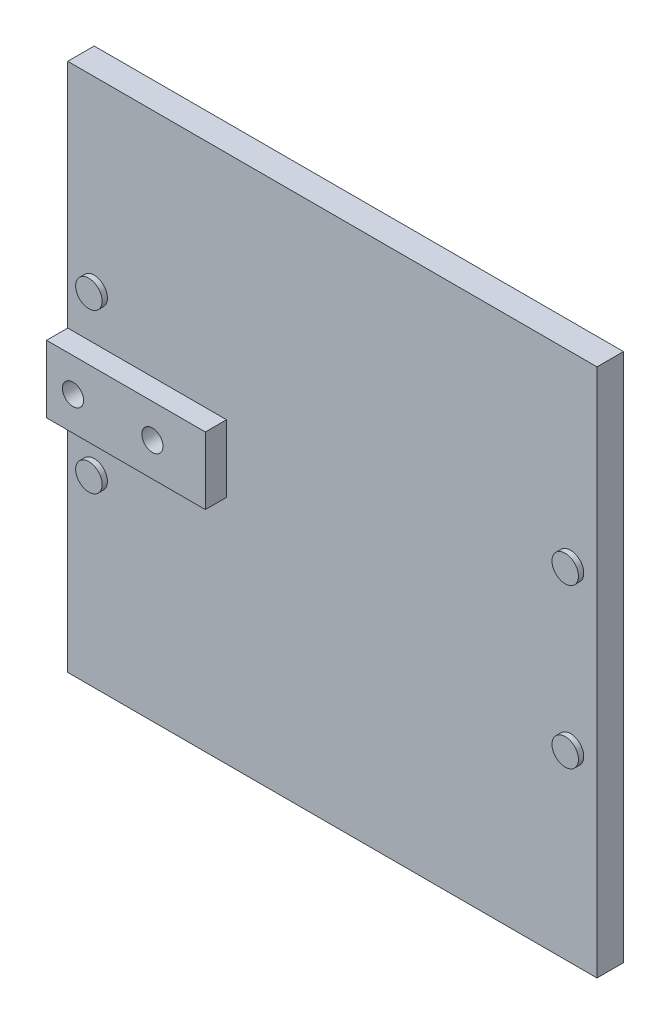
ISO-10303-21;
HEADER;
FILE_DESCRIPTION(('STEP AP214'),'2;1');
FILE_NAME('part.step','',(''),(''),'','','');
FILE_SCHEMA(('AUTOMOTIVE_DESIGN { 1 0 10303 214 1 1 1 1 }'));
ENDSEC;
DATA;
#1=APPLICATION_CONTEXT('core data for automotive mechanical design processes');
#2=APPLICATION_PROTOCOL_DEFINITION('international standard','automotive_design',2000,#1);
#3=PRODUCT_CONTEXT('',#1,'mechanical');
#4=PRODUCT('Part','Part','',(#3));
#5=PRODUCT_RELATED_PRODUCT_CATEGORY('part','',(#4));
#6=PRODUCT_DEFINITION_FORMATION('','',#4);
#7=PRODUCT_DEFINITION_CONTEXT('part definition',#1,'design');
#8=PRODUCT_DEFINITION('design','',#6,#7);
#9=PRODUCT_DEFINITION_SHAPE('','',#8);
#10=(LENGTH_UNIT() NAMED_UNIT(*) SI_UNIT(.MILLI.,.METRE.));
#11=(NAMED_UNIT(*) PLANE_ANGLE_UNIT() SI_UNIT($,.RADIAN.));
#12=(NAMED_UNIT(*) SI_UNIT($,.STERADIAN.) SOLID_ANGLE_UNIT());
#13=UNCERTAINTY_MEASURE_WITH_UNIT(LENGTH_MEASURE(1.E-05),#10,'distance_accuracy_value','');
#14=(GEOMETRIC_REPRESENTATION_CONTEXT(3) GLOBAL_UNCERTAINTY_ASSIGNED_CONTEXT((#13)) GLOBAL_UNIT_ASSIGNED_CONTEXT((#10,
#11,#12)) REPRESENTATION_CONTEXT('',''));
#15=CARTESIAN_POINT('',(0.,0.,0.));
#16=DIRECTION('',(0.,0.,1.));
#17=DIRECTION('',(1.,0.,0.));
#18=AXIS2_PLACEMENT_3D('',#15,#16,#17);
#19=CARTESIAN_POINT('',(45.,-15.,6.));
#20=DIRECTION('',(0.,0.,-1.));
#21=DIRECTION('',(-1.,0.,0.));
#22=AXIS2_PLACEMENT_3D('',#19,#20,#21);
#23=CYLINDRICAL_SURFACE('',#22,2.5);
#24=CARTESIAN_POINT('',(45.,-15.,6.));
#25=DIRECTION('',(0.,0.,1.));
#26=DIRECTION('',(1.,0.,0.));
#27=AXIS2_PLACEMENT_3D('',#24,#25,#26);
#28=CIRCLE('',#27,2.5);
#29=CARTESIAN_POINT('',(47.5,-15.,6.));
#30=VERTEX_POINT('',#29);
#31=EDGE_CURVE('E11',#30,#30,#28,.T.);
#32=ORIENTED_EDGE('',*,*,#31,.F.);
#33=EDGE_LOOP('',(#32));
#34=FACE_BOUND('',#33,.T.);
#35=CARTESIAN_POINT('',(45.,-15.,5.));
#36=DIRECTION('',(0.,0.,1.));
#37=DIRECTION('',(1.,0.,0.));
#38=AXIS2_PLACEMENT_3D('',#35,#36,#37);
#39=CIRCLE('',#38,2.5);
#40=CARTESIAN_POINT('',(47.5,-15.,5.));
#41=VERTEX_POINT('',#40);
#42=EDGE_CURVE('E45',#41,#41,#39,.T.);
#43=ORIENTED_EDGE('',*,*,#42,.T.);
#44=EDGE_LOOP('',(#43));
#45=FACE_BOUND('',#44,.T.);
#46=ADVANCED_FACE('F42',(#34,#45),#23,.T.);
#47=CARTESIAN_POINT('',(45.,-15.,6.));
#48=DIRECTION('',(0.,0.,1.));
#49=DIRECTION('',(1.,0.,0.));
#50=AXIS2_PLACEMENT_3D('',#47,#48,#49);
#51=PLANE('',#50);
#52=ORIENTED_EDGE('',*,*,#31,.T.);
#53=EDGE_LOOP('',(#52));
#54=FACE_BOUND('',#53,.T.);
#55=ADVANCED_FACE('F57',(#54),#51,.T.);
#56=CARTESIAN_POINT('',(45.,-15.,5.));
#57=DIRECTION('',(0.,0.,1.));
#58=DIRECTION('',(1.,0.,0.));
#59=AXIS2_PLACEMENT_3D('',#56,#57,#58);
#60=PLANE('',#59);
#61=ORIENTED_EDGE('',*,*,#42,.F.);
#62=EDGE_LOOP('',(#61));
#63=FACE_BOUND('',#62,.T.);
#64=ADVANCED_FACE('F55',(#63),#60,.F.);
#65=CLOSED_SHELL('',(#46,#55,#64));
#66=MANIFOLD_SOLID_BREP('B2',#65);
#67=CARTESIAN_POINT('',(-45.,-15.,6.));
#68=DIRECTION('',(0.,0.,-1.));
#69=DIRECTION('',(-1.,0.,0.));
#70=AXIS2_PLACEMENT_3D('',#67,#68,#69);
#71=CYLINDRICAL_SURFACE('',#70,2.5);
#72=CARTESIAN_POINT('',(-45.,-15.,6.));
#73=DIRECTION('',(0.,0.,1.));
#74=DIRECTION('',(1.,0.,0.));
#75=AXIS2_PLACEMENT_3D('',#72,#73,#74);
#76=CIRCLE('',#75,2.5);
#77=CARTESIAN_POINT('',(-42.5,-15.,6.));
#78=VERTEX_POINT('',#77);
#79=EDGE_CURVE('E41',#78,#78,#76,.T.);
#80=ORIENTED_EDGE('',*,*,#79,.F.);
#81=EDGE_LOOP('',(#80));
#82=FACE_BOUND('',#81,.T.);
#83=CARTESIAN_POINT('',(-45.,-15.,5.));
#84=DIRECTION('',(0.,0.,1.));
#85=DIRECTION('',(1.,0.,0.));
#86=AXIS2_PLACEMENT_3D('',#83,#84,#85);
#87=CIRCLE('',#86,2.5);
#88=CARTESIAN_POINT('',(-42.5,-15.,5.));
#89=VERTEX_POINT('',#88);
#90=EDGE_CURVE('E94',#89,#89,#87,.T.);
#91=ORIENTED_EDGE('',*,*,#90,.T.);
#92=EDGE_LOOP('',(#91));
#93=FACE_BOUND('',#92,.T.);
#94=ADVANCED_FACE('F91',(#82,#93),#71,.T.);
#95=CARTESIAN_POINT('',(-45.,-15.,6.));
#96=DIRECTION('',(0.,0.,1.));
#97=DIRECTION('',(1.,0.,0.));
#98=AXIS2_PLACEMENT_3D('',#95,#96,#97);
#99=PLANE('',#98);
#100=ORIENTED_EDGE('',*,*,#79,.T.);
#101=EDGE_LOOP('',(#100));
#102=FACE_BOUND('',#101,.T.);
#103=ADVANCED_FACE('F106',(#102),#99,.T.);
#104=CARTESIAN_POINT('',(-45.,-15.,5.));
#105=DIRECTION('',(0.,0.,1.));
#106=DIRECTION('',(1.,0.,0.));
#107=AXIS2_PLACEMENT_3D('',#104,#105,#106);
#108=PLANE('',#107);
#109=ORIENTED_EDGE('',*,*,#90,.F.);
#110=EDGE_LOOP('',(#109));
#111=FACE_BOUND('',#110,.T.);
#112=ADVANCED_FACE('F104',(#111),#108,.F.);
#113=CLOSED_SHELL('',(#94,#103,#112));
#114=MANIFOLD_SOLID_BREP('B6',#113);
#115=CARTESIAN_POINT('',(45.,15.,6.));
#116=DIRECTION('',(0.,0.,-1.));
#117=DIRECTION('',(-1.,0.,0.));
#118=AXIS2_PLACEMENT_3D('',#115,#116,#117);
#119=CYLINDRICAL_SURFACE('',#118,2.5);
#120=CARTESIAN_POINT('',(45.,15.,6.));
#121=DIRECTION('',(0.,0.,1.));
#122=DIRECTION('',(1.,0.,0.));
#123=AXIS2_PLACEMENT_3D('',#120,#121,#122);
#124=CIRCLE('',#123,2.5);
#125=CARTESIAN_POINT('',(47.5,15.,6.));
#126=VERTEX_POINT('',#125);
#127=EDGE_CURVE('E90',#126,#126,#124,.T.);
#128=ORIENTED_EDGE('',*,*,#127,.F.);
#129=EDGE_LOOP('',(#128));
#130=FACE_BOUND('',#129,.T.);
#131=CARTESIAN_POINT('',(45.,15.,5.));
#132=DIRECTION('',(0.,0.,1.));
#133=DIRECTION('',(1.,0.,0.));
#134=AXIS2_PLACEMENT_3D('',#131,#132,#133);
#135=CIRCLE('',#134,2.5);
#136=CARTESIAN_POINT('',(47.5,15.,5.));
#137=VERTEX_POINT('',#136);
#138=EDGE_CURVE('E143',#137,#137,#135,.T.);
#139=ORIENTED_EDGE('',*,*,#138,.T.);
#140=EDGE_LOOP('',(#139));
#141=FACE_BOUND('',#140,.T.);
#142=ADVANCED_FACE('F140',(#130,#141),#119,.T.);
#143=CARTESIAN_POINT('',(45.,15.,6.));
#144=DIRECTION('',(0.,0.,1.));
#145=DIRECTION('',(1.,0.,0.));
#146=AXIS2_PLACEMENT_3D('',#143,#144,#145);
#147=PLANE('',#146);
#148=ORIENTED_EDGE('',*,*,#127,.T.);
#149=EDGE_LOOP('',(#148));
#150=FACE_BOUND('',#149,.T.);
#151=ADVANCED_FACE('F155',(#150),#147,.T.);
#152=CARTESIAN_POINT('',(45.,15.,5.));
#153=DIRECTION('',(0.,0.,1.));
#154=DIRECTION('',(1.,0.,0.));
#155=AXIS2_PLACEMENT_3D('',#152,#153,#154);
#156=PLANE('',#155);
#157=ORIENTED_EDGE('',*,*,#138,.F.);
#158=EDGE_LOOP('',(#157));
#159=FACE_BOUND('',#158,.T.);
#160=ADVANCED_FACE('F153',(#159),#156,.F.);
#161=CLOSED_SHELL('',(#142,#151,#160));
#162=MANIFOLD_SOLID_BREP('B36',#161);
#163=CARTESIAN_POINT('',(-45.,15.,6.));
#164=DIRECTION('',(0.,0.,-1.));
#165=DIRECTION('',(-1.,0.,0.));
#166=AXIS2_PLACEMENT_3D('',#163,#164,#165);
#167=CYLINDRICAL_SURFACE('',#166,2.5);
#168=CARTESIAN_POINT('',(-45.,15.,6.));
#169=DIRECTION('',(0.,0.,1.));
#170=DIRECTION('',(1.,0.,0.));
#171=AXIS2_PLACEMENT_3D('',#168,#169,#170);
#172=CIRCLE('',#171,2.5);
#173=CARTESIAN_POINT('',(-42.5,15.,6.));
#174=VERTEX_POINT('',#173);
#175=EDGE_CURVE('E139',#174,#174,#172,.T.);
#176=ORIENTED_EDGE('',*,*,#175,.F.);
#177=EDGE_LOOP('',(#176));
#178=FACE_BOUND('',#177,.T.);
#179=CARTESIAN_POINT('',(-45.,15.,5.));
#180=DIRECTION('',(0.,0.,1.));
#181=DIRECTION('',(1.,0.,0.));
#182=AXIS2_PLACEMENT_3D('',#179,#180,#181);
#183=CIRCLE('',#182,2.5);
#184=CARTESIAN_POINT('',(-42.5,15.,5.));
#185=VERTEX_POINT('',#184);
#186=EDGE_CURVE('E193',#185,#185,#183,.T.);
#187=ORIENTED_EDGE('',*,*,#186,.T.);
#188=EDGE_LOOP('',(#187));
#189=FACE_BOUND('',#188,.T.);
#190=ADVANCED_FACE('F190',(#178,#189),#167,.T.);
#191=CARTESIAN_POINT('',(-45.,15.,6.));
#192=DIRECTION('',(0.,0.,1.));
#193=DIRECTION('',(1.,0.,0.));
#194=AXIS2_PLACEMENT_3D('',#191,#192,#193);
#195=PLANE('',#194);
#196=ORIENTED_EDGE('',*,*,#175,.T.);
#197=EDGE_LOOP('',(#196));
#198=FACE_BOUND('',#197,.T.);
#199=ADVANCED_FACE('F205',(#198),#195,.T.);
#200=CARTESIAN_POINT('',(-45.,15.,5.));
#201=DIRECTION('',(0.,0.,1.));
#202=DIRECTION('',(1.,0.,0.));
#203=AXIS2_PLACEMENT_3D('',#200,#201,#202);
#204=PLANE('',#203);
#205=ORIENTED_EDGE('',*,*,#186,.F.);
#206=EDGE_LOOP('',(#205));
#207=FACE_BOUND('',#206,.T.);
#208=ADVANCED_FACE('F203',(#207),#204,.F.);
#209=CLOSED_SHELL('',(#190,#199,#208));
#210=MANIFOLD_SOLID_BREP('B85',#209);
#211=CARTESIAN_POINT('',(0.,0.,5.));
#212=DIRECTION('',(0.,0.,1.));
#213=DIRECTION('',(1.,0.,0.));
#214=AXIS2_PLACEMENT_3D('',#211,#212,#213);
#215=PLANE('',#214);
#216=CARTESIAN_POINT('',(-45.,-15.,5.));
#217=DIRECTION('',(0.,0.,1.));
#218=DIRECTION('',(1.,0.,0.));
#219=AXIS2_PLACEMENT_3D('',#216,#217,#218);
#220=CIRCLE('',#219,2.5);
#221=CARTESIAN_POINT('',(-42.5,-15.,5.));
#222=VERTEX_POINT('',#221);
#223=EDGE_CURVE('E368',#222,#222,#220,.T.);
#224=ORIENTED_EDGE('',*,*,#223,.F.);
#225=EDGE_LOOP('',(#224));
#226=FACE_BOUND('',#225,.T.);
#227=DIRECTION('',(1.,0.,0.));
#228=VECTOR('',#227,1.);
#229=CARTESIAN_POINT('',(0.,-6.35,5.));
#230=LINE('',#229,#228);
#231=CARTESIAN_POINT('',(-50.,-6.35,5.));
#232=VERTEX_POINT('',#231);
#233=CARTESIAN_POINT('',(-20.,-6.35,5.));
#234=VERTEX_POINT('',#233);
#235=EDGE_CURVE('E323',#232,#234,#230,.T.);
#236=ORIENTED_EDGE('',*,*,#235,.F.);
#237=DIRECTION('',(0.,-1.,0.));
#238=VECTOR('',#237,1.);
#239=CARTESIAN_POINT('',(-50.,50.,5.));
#240=LINE('',#239,#238);
#241=CARTESIAN_POINT('',(-50.,-50.,5.));
#242=VERTEX_POINT('',#241);
#243=EDGE_CURVE('E347',#232,#242,#240,.T.);
#244=ORIENTED_EDGE('',*,*,#243,.T.);
#245=DIRECTION('',(1.,0.,0.));
#246=VECTOR('',#245,1.);
#247=CARTESIAN_POINT('',(-50.,-50.,5.));
#248=LINE('',#247,#246);
#249=CARTESIAN_POINT('',(50.,-50.,5.));
#250=VERTEX_POINT('',#249);
#251=EDGE_CURVE('E257',#242,#250,#248,.T.);
#252=ORIENTED_EDGE('',*,*,#251,.T.);
#253=DIRECTION('',(0.,1.,0.));
#254=VECTOR('',#253,1.);
#255=CARTESIAN_POINT('',(50.,50.,5.));
#256=LINE('',#255,#254);
#257=CARTESIAN_POINT('',(50.,50.,5.));
#258=VERTEX_POINT('',#257);
#259=EDGE_CURVE('E344',#250,#258,#256,.T.);
#260=ORIENTED_EDGE('',*,*,#259,.T.);
#261=DIRECTION('',(-1.,0.,0.));
#262=VECTOR('',#261,1.);
#263=CARTESIAN_POINT('',(-50.,50.,5.));
#264=LINE('',#263,#262);
#265=CARTESIAN_POINT('',(-50.,50.,5.));
#266=VERTEX_POINT('',#265);
#267=EDGE_CURVE('E285',#258,#266,#264,.T.);
#268=ORIENTED_EDGE('',*,*,#267,.T.);
#269=CARTESIAN_POINT('',(-50.,6.35,5.));
#270=VERTEX_POINT('',#269);
#271=EDGE_CURVE('E348',#266,#270,#240,.T.);
#272=ORIENTED_EDGE('',*,*,#271,.T.);
#273=DIRECTION('',(1.,0.,0.));
#274=VECTOR('',#273,1.);
#275=CARTESIAN_POINT('',(0.,6.35,5.));
#276=LINE('',#275,#274);
#277=CARTESIAN_POINT('',(-20.,6.35,5.));
#278=VERTEX_POINT('',#277);
#279=EDGE_CURVE('E335',#270,#278,#276,.T.);
#280=ORIENTED_EDGE('',*,*,#279,.T.);
#281=DIRECTION('',(0.,-1.,0.));
#282=VECTOR('',#281,1.);
#283=CARTESIAN_POINT('',(-20.,0.,5.));
#284=LINE('',#283,#282);
#285=EDGE_CURVE('E248',#278,#234,#284,.T.);
#286=ORIENTED_EDGE('',*,*,#285,.T.);
#287=EDGE_LOOP('',(#236,#244,#252,#260,#268,#272,#280,#286));
#288=FACE_BOUND('',#287,.T.);
#289=CARTESIAN_POINT('',(-45.,15.,5.));
#290=DIRECTION('',(0.,0.,1.));
#291=DIRECTION('',(1.,0.,0.));
#292=AXIS2_PLACEMENT_3D('',#289,#290,#291);
#293=CIRCLE('',#292,2.5);
#294=CARTESIAN_POINT('',(-42.5,15.,5.));
#295=VERTEX_POINT('',#294);
#296=EDGE_CURVE('E336',#295,#295,#293,.F.);
#297=ORIENTED_EDGE('',*,*,#296,.T.);
#298=EDGE_LOOP('',(#297));
#299=FACE_BOUND('',#298,.T.);
#300=CARTESIAN_POINT('',(45.,15.,5.));
#301=DIRECTION('',(0.,0.,1.));
#302=DIRECTION('',(1.,0.,0.));
#303=AXIS2_PLACEMENT_3D('',#300,#301,#302);
#304=CIRCLE('',#303,2.5);
#305=CARTESIAN_POINT('',(47.5,15.,5.));
#306=VERTEX_POINT('',#305);
#307=EDGE_CURVE('E371',#306,#306,#304,.T.);
#308=ORIENTED_EDGE('',*,*,#307,.F.);
#309=EDGE_LOOP('',(#308));
#310=FACE_BOUND('',#309,.T.);
#311=CARTESIAN_POINT('',(45.,-15.,5.));
#312=DIRECTION('',(0.,0.,1.));
#313=DIRECTION('',(1.,0.,0.));
#314=AXIS2_PLACEMENT_3D('',#311,#312,#313);
#315=CIRCLE('',#314,2.5);
#316=CARTESIAN_POINT('',(47.5,-15.,5.));
#317=VERTEX_POINT('',#316);
#318=EDGE_CURVE('E375',#317,#317,#315,.F.);
#319=ORIENTED_EDGE('',*,*,#318,.T.);
#320=EDGE_LOOP('',(#319));
#321=FACE_BOUND('',#320,.T.);
#322=ADVANCED_FACE('F231',(#226,#288,#299,#310,#321),#215,.T.);
#323=CARTESIAN_POINT('',(0.,0.,0.));
#324=DIRECTION('',(0.,0.,1.));
#325=DIRECTION('',(1.,0.,0.));
#326=AXIS2_PLACEMENT_3D('',#323,#324,#325);
#327=PLANE('',#326);
#328=CARTESIAN_POINT('',(-45.,-15.,0.));
#329=DIRECTION('',(0.,0.,1.));
#330=DIRECTION('',(1.,0.,0.));
#331=AXIS2_PLACEMENT_3D('',#328,#329,#330);
#332=CIRCLE('',#331,2.5);
#333=CARTESIAN_POINT('',(-42.5,-15.,0.));
#334=VERTEX_POINT('',#333);
#335=EDGE_CURVE('E235',#334,#334,#332,.T.);
#336=ORIENTED_EDGE('',*,*,#335,.T.);
#337=EDGE_LOOP('',(#336));
#338=FACE_BOUND('',#337,.T.);
#339=CARTESIAN_POINT('',(45.,15.,0.));
#340=DIRECTION('',(0.,0.,1.));
#341=DIRECTION('',(1.,0.,0.));
#342=AXIS2_PLACEMENT_3D('',#339,#340,#341);
#343=CIRCLE('',#342,2.5);
#344=CARTESIAN_POINT('',(47.5,15.,0.));
#345=VERTEX_POINT('',#344);
#346=EDGE_CURVE('E369',#345,#345,#343,.T.);
#347=ORIENTED_EDGE('',*,*,#346,.T.);
#348=EDGE_LOOP('',(#347));
#349=FACE_BOUND('',#348,.T.);
#350=CARTESIAN_POINT('',(-45.,15.,0.));
#351=DIRECTION('',(0.,0.,1.));
#352=DIRECTION('',(1.,0.,0.));
#353=AXIS2_PLACEMENT_3D('',#350,#351,#352);
#354=CIRCLE('',#353,2.5);
#355=CARTESIAN_POINT('',(-42.5,15.,0.));
#356=VERTEX_POINT('',#355);
#357=EDGE_CURVE('E365',#356,#356,#354,.F.);
#358=ORIENTED_EDGE('',*,*,#357,.F.);
#359=EDGE_LOOP('',(#358));
#360=FACE_BOUND('',#359,.T.);
#361=DIRECTION('',(0.,1.,0.));
#362=VECTOR('',#361,1.);
#363=CARTESIAN_POINT('',(50.,50.,0.));
#364=LINE('',#363,#362);
#365=CARTESIAN_POINT('',(50.,-50.,0.));
#366=VERTEX_POINT('',#365);
#367=CARTESIAN_POINT('',(50.,50.,0.));
#368=VERTEX_POINT('',#367);
#369=EDGE_CURVE('E313',#366,#368,#364,.T.);
#370=ORIENTED_EDGE('',*,*,#369,.F.);
#371=DIRECTION('',(1.,0.,0.));
#372=VECTOR('',#371,1.);
#373=CARTESIAN_POINT('',(-50.,-50.,0.));
#374=LINE('',#373,#372);
#375=CARTESIAN_POINT('',(-50.,-50.,0.));
#376=VERTEX_POINT('',#375);
#377=EDGE_CURVE('E278',#376,#366,#374,.T.);
#378=ORIENTED_EDGE('',*,*,#377,.F.);
#379=DIRECTION('',(0.,-1.,0.));
#380=VECTOR('',#379,1.);
#381=CARTESIAN_POINT('',(-50.,50.,0.));
#382=LINE('',#381,#380);
#383=CARTESIAN_POINT('',(-50.,50.,0.));
#384=VERTEX_POINT('',#383);
#385=EDGE_CURVE('E357',#384,#376,#382,.T.);
#386=ORIENTED_EDGE('',*,*,#385,.F.);
#387=DIRECTION('',(-1.,0.,0.));
#388=VECTOR('',#387,1.);
#389=CARTESIAN_POINT('',(-50.,50.,0.));
#390=LINE('',#389,#388);
#391=EDGE_CURVE('E355',#368,#384,#390,.T.);
#392=ORIENTED_EDGE('',*,*,#391,.F.);
#393=EDGE_LOOP('',(#370,#378,#386,#392));
#394=FACE_BOUND('',#393,.T.);
#395=CARTESIAN_POINT('',(45.,-15.,0.));
#396=DIRECTION('',(0.,0.,1.));
#397=DIRECTION('',(1.,0.,0.));
#398=AXIS2_PLACEMENT_3D('',#395,#396,#397);
#399=CIRCLE('',#398,2.5);
#400=CARTESIAN_POINT('',(47.5,-15.,0.));
#401=VERTEX_POINT('',#400);
#402=EDGE_CURVE('E373',#401,#401,#399,.F.);
#403=ORIENTED_EDGE('',*,*,#402,.F.);
#404=EDGE_LOOP('',(#403));
#405=FACE_BOUND('',#404,.T.);
#406=ADVANCED_FACE('F400',(#338,#349,#360,#394,#405),#327,.F.);
#407=CARTESIAN_POINT('',(50.,50.,5.));
#408=DIRECTION('',(-1.,0.,0.));
#409=DIRECTION('',(0.,-1.,0.));
#410=AXIS2_PLACEMENT_3D('',#407,#408,#409);
#411=PLANE('',#410);
#412=ORIENTED_EDGE('',*,*,#369,.T.);
#413=DIRECTION('',(0.,0.,-1.));
#414=VECTOR('',#413,1.);
#415=CARTESIAN_POINT('',(50.,50.,5.));
#416=LINE('',#415,#414);
#417=EDGE_CURVE('E188',#258,#368,#416,.T.);
#418=ORIENTED_EDGE('',*,*,#417,.F.);
#419=ORIENTED_EDGE('',*,*,#259,.F.);
#420=DIRECTION('',(0.,0.,-1.));
#421=VECTOR('',#420,1.);
#422=CARTESIAN_POINT('',(50.,-50.,5.));
#423=LINE('',#422,#421);
#424=EDGE_CURVE('E352',#250,#366,#423,.T.);
#425=ORIENTED_EDGE('',*,*,#424,.T.);
#426=EDGE_LOOP('',(#412,#418,#419,#425));
#427=FACE_BOUND('',#426,.T.);
#428=ADVANCED_FACE('F233',(#427),#411,.F.);
#429=CARTESIAN_POINT('',(-50.,50.,5.));
#430=DIRECTION('',(0.,-1.,0.));
#431=DIRECTION('',(0.,0.,-1.));
#432=AXIS2_PLACEMENT_3D('',#429,#430,#431);
#433=PLANE('',#432);
#434=ORIENTED_EDGE('',*,*,#391,.T.);
#435=DIRECTION('',(0.,0.,-1.));
#436=VECTOR('',#435,1.);
#437=CARTESIAN_POINT('',(-50.,50.,5.));
#438=LINE('',#437,#436);
#439=EDGE_CURVE('E240',#266,#384,#438,.T.);
#440=ORIENTED_EDGE('',*,*,#439,.F.);
#441=ORIENTED_EDGE('',*,*,#267,.F.);
#442=ORIENTED_EDGE('',*,*,#417,.T.);
#443=EDGE_LOOP('',(#434,#440,#441,#442));
#444=FACE_BOUND('',#443,.T.);
#445=ADVANCED_FACE('F418',(#444),#433,.F.);
#446=CARTESIAN_POINT('',(-50.,50.,5.));
#447=DIRECTION('',(1.,0.,0.));
#448=DIRECTION('',(0.,1.,0.));
#449=AXIS2_PLACEMENT_3D('',#446,#447,#448);
#450=PLANE('',#449);
#451=ORIENTED_EDGE('',*,*,#385,.T.);
#452=DIRECTION('',(0.,0.,-1.));
#453=VECTOR('',#452,1.);
#454=CARTESIAN_POINT('',(-50.,-50.,5.));
#455=LINE('',#454,#453);
#456=EDGE_CURVE('E361',#242,#376,#455,.T.);
#457=ORIENTED_EDGE('',*,*,#456,.F.);
#458=ORIENTED_EDGE('',*,*,#243,.F.);
#459=DIRECTION('',(0.,0.,-1.));
#460=VECTOR('',#459,1.);
#461=CARTESIAN_POINT('',(-50.,-6.35,9.));
#462=LINE('',#461,#460);
#463=CARTESIAN_POINT('',(-50.,-6.35,9.));
#464=VERTEX_POINT('',#463);
#465=EDGE_CURVE('E341',#464,#232,#462,.T.);
#466=ORIENTED_EDGE('',*,*,#465,.F.);
#467=DIRECTION('',(0.,-1.,0.));
#468=VECTOR('',#467,1.);
#469=CARTESIAN_POINT('',(-50.,0.,9.));
#470=LINE('',#469,#468);
#471=CARTESIAN_POINT('',(-50.,6.35,9.));
#472=VERTEX_POINT('',#471);
#473=EDGE_CURVE('E327',#472,#464,#470,.T.);
#474=ORIENTED_EDGE('',*,*,#473,.F.);
#475=DIRECTION('',(0.,0.,-1.));
#476=VECTOR('',#475,1.);
#477=CARTESIAN_POINT('',(-50.,6.35,9.));
#478=LINE('',#477,#476);
#479=EDGE_CURVE('E314',#472,#270,#478,.T.);
#480=ORIENTED_EDGE('',*,*,#479,.T.);
#481=ORIENTED_EDGE('',*,*,#271,.F.);
#482=ORIENTED_EDGE('',*,*,#439,.T.);
#483=EDGE_LOOP('',(#451,#457,#458,#466,#474,#480,#481,#482));
#484=FACE_BOUND('',#483,.T.);
#485=ADVANCED_FACE('F415',(#484),#450,.F.);
#486=CARTESIAN_POINT('',(-50.,-50.,5.));
#487=DIRECTION('',(0.,1.,0.));
#488=DIRECTION('',(0.,0.,1.));
#489=AXIS2_PLACEMENT_3D('',#486,#487,#488);
#490=PLANE('',#489);
#491=ORIENTED_EDGE('',*,*,#377,.T.);
#492=ORIENTED_EDGE('',*,*,#424,.F.);
#493=ORIENTED_EDGE('',*,*,#251,.F.);
#494=ORIENTED_EDGE('',*,*,#456,.T.);
#495=EDGE_LOOP('',(#491,#492,#493,#494));
#496=FACE_BOUND('',#495,.T.);
#497=ADVANCED_FACE('F411',(#496),#490,.F.);
#498=CARTESIAN_POINT('',(-20.,0.,9.));
#499=DIRECTION('',(1.,0.,0.));
#500=DIRECTION('',(0.,1.,0.));
#501=AXIS2_PLACEMENT_3D('',#498,#499,#500);
#502=PLANE('',#501);
#503=ORIENTED_EDGE('',*,*,#285,.F.);
#504=DIRECTION('',(0.,0.,-1.));
#505=VECTOR('',#504,1.);
#506=CARTESIAN_POINT('',(-20.,6.35,9.));
#507=LINE('',#506,#505);
#508=CARTESIAN_POINT('',(-20.,6.35,9.));
#509=VERTEX_POINT('',#508);
#510=EDGE_CURVE('E305',#509,#278,#507,.T.);
#511=ORIENTED_EDGE('',*,*,#510,.F.);
#512=DIRECTION('',(0.,-1.,0.));
#513=VECTOR('',#512,1.);
#514=CARTESIAN_POINT('',(-20.,0.,9.));
#515=LINE('',#514,#513);
#516=CARTESIAN_POINT('',(-20.,-6.35,9.));
#517=VERTEX_POINT('',#516);
#518=EDGE_CURVE('E308',#509,#517,#515,.T.);
#519=ORIENTED_EDGE('',*,*,#518,.T.);
#520=DIRECTION('',(0.,0.,-1.));
#521=VECTOR('',#520,1.);
#522=CARTESIAN_POINT('',(-20.,-6.35,9.));
#523=LINE('',#522,#521);
#524=EDGE_CURVE('E333',#517,#234,#523,.T.);
#525=ORIENTED_EDGE('',*,*,#524,.T.);
#526=EDGE_LOOP('',(#503,#511,#519,#525));
#527=FACE_BOUND('',#526,.T.);
#528=ADVANCED_FACE('F307',(#527),#502,.T.);
#529=CARTESIAN_POINT('',(0.,6.35,9.));
#530=DIRECTION('',(0.,1.,0.));
#531=DIRECTION('',(0.,0.,1.));
#532=AXIS2_PLACEMENT_3D('',#529,#530,#531);
#533=PLANE('',#532);
#534=ORIENTED_EDGE('',*,*,#279,.F.);
#535=ORIENTED_EDGE('',*,*,#479,.F.);
#536=DIRECTION('',(1.,0.,0.));
#537=VECTOR('',#536,1.);
#538=CARTESIAN_POINT('',(0.,6.35,9.));
#539=LINE('',#538,#537);
#540=EDGE_CURVE('E319',#472,#509,#539,.T.);
#541=ORIENTED_EDGE('',*,*,#540,.T.);
#542=ORIENTED_EDGE('',*,*,#510,.T.);
#543=EDGE_LOOP('',(#534,#535,#541,#542));
#544=FACE_BOUND('',#543,.T.);
#545=ADVANCED_FACE('F325',(#544),#533,.T.);
#546=CARTESIAN_POINT('',(0.,-6.35,9.));
#547=DIRECTION('',(0.,1.,0.));
#548=DIRECTION('',(0.,0.,1.));
#549=AXIS2_PLACEMENT_3D('',#546,#547,#548);
#550=PLANE('',#549);
#551=ORIENTED_EDGE('',*,*,#235,.T.);
#552=ORIENTED_EDGE('',*,*,#524,.F.);
#553=DIRECTION('',(1.,0.,0.));
#554=VECTOR('',#553,1.);
#555=CARTESIAN_POINT('',(0.,-6.35,9.));
#556=LINE('',#555,#554);
#557=EDGE_CURVE('E321',#464,#517,#556,.T.);
#558=ORIENTED_EDGE('',*,*,#557,.F.);
#559=ORIENTED_EDGE('',*,*,#465,.T.);
#560=EDGE_LOOP('',(#551,#552,#558,#559));
#561=FACE_BOUND('',#560,.T.);
#562=ADVANCED_FACE('F441',(#561),#550,.F.);
#563=CARTESIAN_POINT('',(0.,0.,9.));
#564=DIRECTION('',(0.,0.,1.));
#565=DIRECTION('',(1.,0.,0.));
#566=AXIS2_PLACEMENT_3D('',#563,#564,#565);
#567=PLANE('',#566);
#568=CARTESIAN_POINT('',(-30.,0.,9.));
#569=DIRECTION('',(0.,0.,1.));
#570=DIRECTION('',(1.,0.,0.));
#571=AXIS2_PLACEMENT_3D('',#568,#569,#570);
#572=CIRCLE('',#571,2.);
#573=CARTESIAN_POINT('',(-28.,0.,9.));
#574=VERTEX_POINT('',#573);
#575=EDGE_CURVE('E482',#574,#574,#572,.T.);
#576=ORIENTED_EDGE('',*,*,#575,.F.);
#577=EDGE_LOOP('',(#576));
#578=FACE_BOUND('',#577,.T.);
#579=CARTESIAN_POINT('',(-45.,0.,9.));
#580=DIRECTION('',(0.,0.,1.));
#581=DIRECTION('',(1.,0.,0.));
#582=AXIS2_PLACEMENT_3D('',#579,#580,#581);
#583=CIRCLE('',#582,2.);
#584=CARTESIAN_POINT('',(-43.,0.,9.));
#585=VERTEX_POINT('',#584);
#586=EDGE_CURVE('E481',#585,#585,#583,.T.);
#587=ORIENTED_EDGE('',*,*,#586,.F.);
#588=EDGE_LOOP('',(#587));
#589=FACE_BOUND('',#588,.T.);
#590=ORIENTED_EDGE('',*,*,#518,.F.);
#591=ORIENTED_EDGE('',*,*,#540,.F.);
#592=ORIENTED_EDGE('',*,*,#473,.T.);
#593=ORIENTED_EDGE('',*,*,#557,.T.);
#594=EDGE_LOOP('',(#590,#591,#592,#593));
#595=FACE_BOUND('',#594,.T.);
#596=ADVANCED_FACE('F318',(#578,#589,#595),#567,.T.);
#597=CARTESIAN_POINT('',(-45.,15.,9.));
#598=DIRECTION('',(0.,0.,-1.));
#599=DIRECTION('',(-1.,0.,0.));
#600=AXIS2_PLACEMENT_3D('',#597,#598,#599);
#601=CYLINDRICAL_SURFACE('',#600,2.5);
#602=ORIENTED_EDGE('',*,*,#296,.F.);
#603=EDGE_LOOP('',(#602));
#604=FACE_BOUND('',#603,.T.);
#605=ORIENTED_EDGE('',*,*,#357,.T.);
#606=EDGE_LOOP('',(#605));
#607=FACE_BOUND('',#606,.T.);
#608=ADVANCED_FACE('F393',(#604,#607),#601,.F.);
#609=CARTESIAN_POINT('',(45.,15.,9.));
#610=DIRECTION('',(0.,0.,-1.));
#611=DIRECTION('',(-1.,0.,0.));
#612=AXIS2_PLACEMENT_3D('',#609,#610,#611);
#613=CYLINDRICAL_SURFACE('',#612,2.5);
#614=ORIENTED_EDGE('',*,*,#307,.T.);
#615=EDGE_LOOP('',(#614));
#616=FACE_BOUND('',#615,.T.);
#617=ORIENTED_EDGE('',*,*,#346,.F.);
#618=EDGE_LOOP('',(#617));
#619=FACE_BOUND('',#618,.T.);
#620=ADVANCED_FACE('F396',(#616,#619),#613,.F.);
#621=CARTESIAN_POINT('',(45.,-15.,9.));
#622=DIRECTION('',(0.,0.,-1.));
#623=DIRECTION('',(-1.,0.,0.));
#624=AXIS2_PLACEMENT_3D('',#621,#622,#623);
#625=CYLINDRICAL_SURFACE('',#624,2.5);
#626=ORIENTED_EDGE('',*,*,#318,.F.);
#627=EDGE_LOOP('',(#626));
#628=FACE_BOUND('',#627,.T.);
#629=ORIENTED_EDGE('',*,*,#402,.T.);
#630=EDGE_LOOP('',(#629));
#631=FACE_BOUND('',#630,.T.);
#632=ADVANCED_FACE('F453',(#628,#631),#625,.F.);
#633=CARTESIAN_POINT('',(-45.,-15.,9.));
#634=DIRECTION('',(0.,0.,-1.));
#635=DIRECTION('',(-1.,0.,0.));
#636=AXIS2_PLACEMENT_3D('',#633,#634,#635);
#637=CYLINDRICAL_SURFACE('',#636,2.5);
#638=ORIENTED_EDGE('',*,*,#223,.T.);
#639=EDGE_LOOP('',(#638));
#640=FACE_BOUND('',#639,.T.);
#641=ORIENTED_EDGE('',*,*,#335,.F.);
#642=EDGE_LOOP('',(#641));
#643=FACE_BOUND('',#642,.T.);
#644=ADVANCED_FACE('F456',(#640,#643),#637,.F.);
#645=CARTESIAN_POINT('',(-45.,0.,-0.656854249492387));
#646=DIRECTION('',(0.,0.,1.));
#647=DIRECTION('',(1.,0.,0.));
#648=AXIS2_PLACEMENT_3D('',#645,#646,#647);
#649=CYLINDRICAL_SURFACE('',#648,2.);
#650=CARTESIAN_POINT('',(-45.,0.,5.));
#651=DIRECTION('',(0.,0.,1.));
#652=DIRECTION('',(1.,0.,0.));
#653=AXIS2_PLACEMENT_3D('',#650,#651,#652);
#654=CIRCLE('',#653,2.);
#655=CARTESIAN_POINT('',(-43.,0.,5.));
#656=VERTEX_POINT('',#655);
#657=EDGE_CURVE('E372',#656,#656,#654,.F.);
#658=ORIENTED_EDGE('',*,*,#657,.T.);
#659=EDGE_LOOP('',(#658));
#660=FACE_BOUND('',#659,.T.);
#661=ORIENTED_EDGE('',*,*,#586,.T.);
#662=EDGE_LOOP('',(#661));
#663=FACE_BOUND('',#662,.T.);
#664=ADVANCED_FACE('F460',(#660,#663),#649,.F.);
#665=CARTESIAN_POINT('',(0.,0.,5.));
#666=DIRECTION('',(0.,0.,1.));
#667=DIRECTION('',(1.,0.,0.));
#668=AXIS2_PLACEMENT_3D('',#665,#666,#667);
#669=PLANE('',#668);
#670=ORIENTED_EDGE('',*,*,#657,.F.);
#671=EDGE_LOOP('',(#670));
#672=FACE_BOUND('',#671,.T.);
#673=ADVANCED_FACE('F464',(#672),#669,.T.);
#674=CARTESIAN_POINT('',(-30.,0.,-0.656854249492387));
#675=DIRECTION('',(0.,0.,1.));
#676=DIRECTION('',(1.,0.,0.));
#677=AXIS2_PLACEMENT_3D('',#674,#675,#676);
#678=CYLINDRICAL_SURFACE('',#677,2.);
#679=CARTESIAN_POINT('',(-30.,0.,5.));
#680=DIRECTION('',(0.,0.,1.));
#681=DIRECTION('',(1.,0.,0.));
#682=AXIS2_PLACEMENT_3D('',#679,#680,#681);
#683=CIRCLE('',#682,2.);
#684=CARTESIAN_POINT('',(-28.,0.,5.));
#685=VERTEX_POINT('',#684);
#686=EDGE_CURVE('E480',#685,#685,#683,.F.);
#687=ORIENTED_EDGE('',*,*,#686,.T.);
#688=EDGE_LOOP('',(#687));
#689=FACE_BOUND('',#688,.T.);
#690=ORIENTED_EDGE('',*,*,#575,.T.);
#691=EDGE_LOOP('',(#690));
#692=FACE_BOUND('',#691,.T.);
#693=ADVANCED_FACE('F468',(#689,#692),#678,.F.);
#694=CARTESIAN_POINT('',(0.,0.,5.));
#695=DIRECTION('',(0.,0.,1.));
#696=DIRECTION('',(1.,0.,0.));
#697=AXIS2_PLACEMENT_3D('',#694,#695,#696);
#698=PLANE('',#697);
#699=ORIENTED_EDGE('',*,*,#686,.F.);
#700=EDGE_LOOP('',(#699));
#701=FACE_BOUND('',#700,.T.);
#702=ADVANCED_FACE('F472',(#701),#698,.T.);
#703=CLOSED_SHELL('',(#322,#406,#428,#445,#485,#497,#528,#545,#562,#596,#608,#620,#632,#644,
#664,#673,#693,#702));
#704=MANIFOLD_SOLID_BREP('B134',#703);
#705=ADVANCED_BREP_SHAPE_REPRESENTATION('',(#18,#66,#114,#162,#210,#704),#14);
#706=SHAPE_DEFINITION_REPRESENTATION(#9,#705);
ENDSEC;
END-ISO-10303-21;
